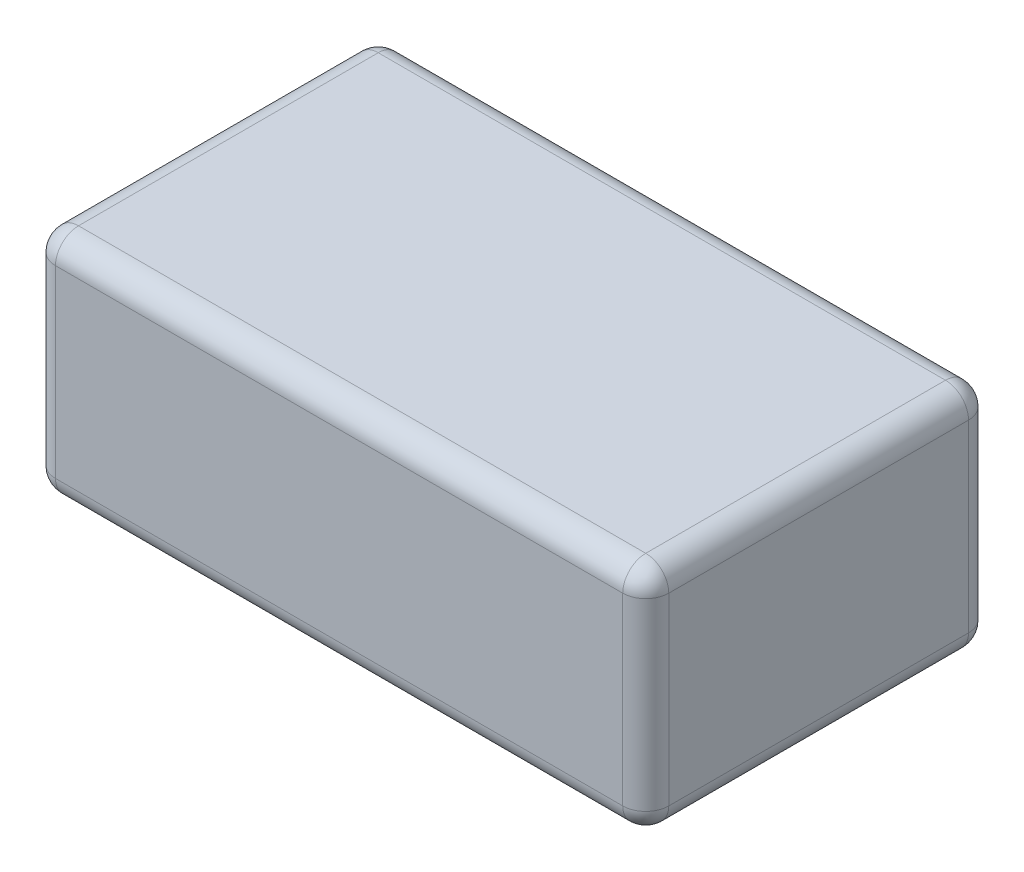
ISO-10303-21;
HEADER;
FILE_DESCRIPTION(('STEP AP214'),'2;1');
FILE_NAME('part.step','',(''),(''),'','','');
FILE_SCHEMA(('AUTOMOTIVE_DESIGN { 1 0 10303 214 1 1 1 1 }'));
ENDSEC;
DATA;
#1=APPLICATION_CONTEXT('core data for automotive mechanical design processes');
#2=APPLICATION_PROTOCOL_DEFINITION('international standard','automotive_design',2000,#1);
#3=PRODUCT_CONTEXT('',#1,'mechanical');
#4=PRODUCT('Part','Part','',(#3));
#5=PRODUCT_RELATED_PRODUCT_CATEGORY('part','',(#4));
#6=PRODUCT_DEFINITION_FORMATION('','',#4);
#7=PRODUCT_DEFINITION_CONTEXT('part definition',#1,'design');
#8=PRODUCT_DEFINITION('design','',#6,#7);
#9=PRODUCT_DEFINITION_SHAPE('','',#8);
#10=(LENGTH_UNIT() NAMED_UNIT(*) SI_UNIT(.MILLI.,.METRE.));
#11=(NAMED_UNIT(*) PLANE_ANGLE_UNIT() SI_UNIT($,.RADIAN.));
#12=(NAMED_UNIT(*) SI_UNIT($,.STERADIAN.) SOLID_ANGLE_UNIT());
#13=UNCERTAINTY_MEASURE_WITH_UNIT(LENGTH_MEASURE(1.E-05),#10,'distance_accuracy_value','');
#14=(GEOMETRIC_REPRESENTATION_CONTEXT(3) GLOBAL_UNCERTAINTY_ASSIGNED_CONTEXT((#13)) GLOBAL_UNIT_ASSIGNED_CONTEXT((#10,
#11,#12)) REPRESENTATION_CONTEXT('',''));
#15=CARTESIAN_POINT('',(0.,0.,0.));
#16=DIRECTION('',(0.,0.,1.));
#17=DIRECTION('',(1.,0.,0.));
#18=AXIS2_PLACEMENT_3D('',#15,#16,#17);
#19=CARTESIAN_POINT('',(-0.845465216249173,0.127,0.826383161041259));
#20=DIRECTION('',(1.,0.,0.));
#21=DIRECTION('',(0.,-0.707106781186548,0.707106781186547));
#22=AXIS2_PLACEMENT_3D('',#19,#20,#21);
#23=CYLINDRICAL_SURFACE('',#22,0.127);
#24=CARTESIAN_POINT('',(-1.56393043249835,0.127,0.826383161041259));
#25=DIRECTION('',(1.,0.,0.));
#26=DIRECTION('',(0.,0.,1.));
#27=AXIS2_PLACEMENT_3D('',#24,#25,#26);
#28=CIRCLE('',#27,0.127);
#29=CARTESIAN_POINT('',(-1.56393043249835,0.127,0.953383161041259));
#30=VERTEX_POINT('',#29);
#31=CARTESIAN_POINT('',(-1.56393043249835,0.,0.826383161041259));
#32=VERTEX_POINT('',#31);
#33=EDGE_CURVE('E178',#30,#32,#28,.T.);
#34=ORIENTED_EDGE('',*,*,#33,.T.);
#35=DIRECTION('',(1.,0.,0.));
#36=VECTOR('',#35,1.);
#37=CARTESIAN_POINT('',(-0.845465216249173,0.,0.826383161041259));
#38=LINE('',#37,#36);
#39=CARTESIAN_POINT('',(1.56393043249835,0.,0.826383161041259));
#40=VERTEX_POINT('',#39);
#41=EDGE_CURVE('E172',#32,#40,#38,.T.);
#42=ORIENTED_EDGE('',*,*,#41,.T.);
#43=CARTESIAN_POINT('',(1.56393043249835,0.127,0.826383161041259));
#44=DIRECTION('',(-1.,0.,0.));
#45=DIRECTION('',(0.,-1.,0.));
#46=AXIS2_PLACEMENT_3D('',#43,#44,#45);
#47=CIRCLE('',#46,0.127);
#48=CARTESIAN_POINT('',(1.56393043249835,0.127,0.953383161041259));
#49=VERTEX_POINT('',#48);
#50=EDGE_CURVE('E11',#40,#49,#47,.T.);
#51=ORIENTED_EDGE('',*,*,#50,.T.);
#52=DIRECTION('',(-1.,0.,0.));
#53=VECTOR('',#52,1.);
#54=CARTESIAN_POINT('',(-0.845465216249173,0.127,0.953383161041259));
#55=LINE('',#54,#53);
#56=EDGE_CURVE('E295',#49,#30,#55,.T.);
#57=ORIENTED_EDGE('',*,*,#56,.T.);
#58=EDGE_LOOP('',(#34,#42,#51,#57));
#59=FACE_BOUND('',#58,.T.);
#60=ADVANCED_FACE('F16',(#59),#23,.T.);
#61=CARTESIAN_POINT('',(1.56393043249835,0.127,0.476691580520629));
#62=DIRECTION('',(0.,0.,-1.));
#63=DIRECTION('',(0.707106781186547,-0.707106781186548,0.));
#64=AXIS2_PLACEMENT_3D('',#61,#62,#63);
#65=CYLINDRICAL_SURFACE('',#64,0.127);
#66=CARTESIAN_POINT('',(1.56393043249835,0.127,0.826383161041259));
#67=DIRECTION('',(0.,0.,-1.));
#68=DIRECTION('',(1.,0.,0.));
#69=AXIS2_PLACEMENT_3D('',#66,#67,#68);
#70=CIRCLE('',#69,0.127);
#71=CARTESIAN_POINT('',(1.69093043249835,0.127,0.826383161041259));
#72=VERTEX_POINT('',#71);
#73=EDGE_CURVE('E27',#72,#40,#70,.T.);
#74=ORIENTED_EDGE('',*,*,#73,.T.);
#75=DIRECTION('',(0.,0.,-1.));
#76=VECTOR('',#75,1.);
#77=CARTESIAN_POINT('',(1.56393043249835,0.,0.476691580520629));
#78=LINE('',#77,#76);
#79=CARTESIAN_POINT('',(1.56393043249835,0.,-0.826383161041259));
#80=VERTEX_POINT('',#79);
#81=EDGE_CURVE('E161',#40,#80,#78,.T.);
#82=ORIENTED_EDGE('',*,*,#81,.T.);
#83=CARTESIAN_POINT('',(1.56393043249835,0.127,-0.826383161041259));
#84=DIRECTION('',(0.,0.,1.));
#85=DIRECTION('',(0.,-1.,0.));
#86=AXIS2_PLACEMENT_3D('',#83,#84,#85);
#87=CIRCLE('',#86,0.127);
#88=CARTESIAN_POINT('',(1.69093043249835,0.127,-0.826383161041259));
#89=VERTEX_POINT('',#88);
#90=EDGE_CURVE('E20',#80,#89,#87,.T.);
#91=ORIENTED_EDGE('',*,*,#90,.T.);
#92=DIRECTION('',(0.,0.,1.));
#93=VECTOR('',#92,1.);
#94=CARTESIAN_POINT('',(1.69093043249835,0.127,0.476691580520629));
#95=LINE('',#94,#93);
#96=EDGE_CURVE('E164',#89,#72,#95,.T.);
#97=ORIENTED_EDGE('',*,*,#96,.T.);
#98=EDGE_LOOP('',(#74,#82,#91,#97));
#99=FACE_BOUND('',#98,.T.);
#100=ADVANCED_FACE('F160',(#99),#65,.T.);
#101=CARTESIAN_POINT('',(1.56393043249835,0.127,0.826383161041259));
#102=DIRECTION('',(-0.408248290463863,-0.816496580927726,-0.408248290463863));
#103=DIRECTION('',(0.577350269189626,-0.577350269189625,0.577350269189626));
#104=AXIS2_PLACEMENT_3D('',#101,#102,#103);
#105=SPHERICAL_SURFACE('',#104,0.127);
#106=ORIENTED_EDGE('',*,*,#73,.F.);
#107=CARTESIAN_POINT('',(1.56393043249835,0.127,0.826383161041259));
#108=DIRECTION('',(0.,-1.,0.));
#109=DIRECTION('',(0.707106781186548,0.,0.707106781186548));
#110=AXIS2_PLACEMENT_3D('',#107,#108,#109);
#111=CIRCLE('',#110,0.127);
#112=EDGE_CURVE('E156',#72,#49,#111,.T.);
#113=ORIENTED_EDGE('',*,*,#112,.T.);
#114=ORIENTED_EDGE('',*,*,#50,.F.);
#115=EDGE_LOOP('',(#106,#113,#114));
#116=FACE_BOUND('',#115,.T.);
#117=ADVANCED_FACE('F154',(#116),#105,.T.);
#118=CARTESIAN_POINT('',(0.845465216249173,0.127,-0.826383161041259));
#119=DIRECTION('',(-1.,0.,0.));
#120=DIRECTION('',(0.,-0.707106781186548,-0.707106781186547));
#121=AXIS2_PLACEMENT_3D('',#118,#119,#120);
#122=CYLINDRICAL_SURFACE('',#121,0.127);
#123=CARTESIAN_POINT('',(1.56393043249835,0.127,-0.826383161041259));
#124=DIRECTION('',(-1.,0.,0.));
#125=DIRECTION('',(0.,0.,-1.));
#126=AXIS2_PLACEMENT_3D('',#123,#124,#125);
#127=CIRCLE('',#126,0.127);
#128=CARTESIAN_POINT('',(1.56393043249835,0.127,-0.953383161041259));
#129=VERTEX_POINT('',#128);
#130=EDGE_CURVE('E41',#129,#80,#127,.T.);
#131=ORIENTED_EDGE('',*,*,#130,.T.);
#132=DIRECTION('',(-1.,0.,0.));
#133=VECTOR('',#132,1.);
#134=CARTESIAN_POINT('',(0.845465216249173,0.,-0.826383161041259));
#135=LINE('',#134,#133);
#136=CARTESIAN_POINT('',(-1.56393043249835,0.,-0.826383161041259));
#137=VERTEX_POINT('',#136);
#138=EDGE_CURVE('E174',#80,#137,#135,.T.);
#139=ORIENTED_EDGE('',*,*,#138,.T.);
#140=CARTESIAN_POINT('',(-1.56393043249835,0.127,-0.826383161041259));
#141=DIRECTION('',(1.,0.,0.));
#142=DIRECTION('',(0.,-1.,0.));
#143=AXIS2_PLACEMENT_3D('',#140,#141,#142);
#144=CIRCLE('',#143,0.127);
#145=CARTESIAN_POINT('',(-1.56393043249835,0.127,-0.953383161041259));
#146=VERTEX_POINT('',#145);
#147=EDGE_CURVE('E226',#137,#146,#144,.T.);
#148=ORIENTED_EDGE('',*,*,#147,.T.);
#149=DIRECTION('',(1.,0.,0.));
#150=VECTOR('',#149,1.);
#151=CARTESIAN_POINT('',(0.845465216249173,0.127,-0.953383161041259));
#152=LINE('',#151,#150);
#153=EDGE_CURVE('E250',#146,#129,#152,.T.);
#154=ORIENTED_EDGE('',*,*,#153,.T.);
#155=EDGE_LOOP('',(#131,#139,#148,#154));
#156=FACE_BOUND('',#155,.T.);
#157=ADVANCED_FACE('F433',(#156),#122,.T.);
#158=CARTESIAN_POINT('',(1.56393043249835,0.127,-0.826383161041259));
#159=DIRECTION('',(-0.408248290463863,-0.816496580927726,0.408248290463863));
#160=DIRECTION('',(0.577350269189626,-0.577350269189625,-0.577350269189626));
#161=AXIS2_PLACEMENT_3D('',#158,#159,#160);
#162=SPHERICAL_SURFACE('',#161,0.127);
#163=ORIENTED_EDGE('',*,*,#130,.F.);
#164=CARTESIAN_POINT('',(1.56393043249835,0.127,-0.826383161041259));
#165=DIRECTION('',(0.,-1.,0.));
#166=DIRECTION('',(0.707106781186548,0.,-0.707106781186548));
#167=AXIS2_PLACEMENT_3D('',#164,#165,#166);
#168=CIRCLE('',#167,0.127);
#169=EDGE_CURVE('E225',#129,#89,#168,.T.);
#170=ORIENTED_EDGE('',*,*,#169,.T.);
#171=ORIENTED_EDGE('',*,*,#90,.F.);
#172=EDGE_LOOP('',(#163,#170,#171));
#173=FACE_BOUND('',#172,.T.);
#174=ADVANCED_FACE('F493',(#173),#162,.T.);
#175=CARTESIAN_POINT('',(-1.56393043249835,0.127,-0.476691580520629));
#176=DIRECTION('',(0.,0.,1.));
#177=DIRECTION('',(-0.707106781186547,-0.707106781186548,0.));
#178=AXIS2_PLACEMENT_3D('',#175,#176,#177);
#179=CYLINDRICAL_SURFACE('',#178,0.127);
#180=CARTESIAN_POINT('',(-1.56393043249835,0.127,-0.826383161041259));
#181=DIRECTION('',(0.,0.,1.));
#182=DIRECTION('',(-1.,0.,0.));
#183=AXIS2_PLACEMENT_3D('',#180,#181,#182);
#184=CIRCLE('',#183,0.127);
#185=CARTESIAN_POINT('',(-1.69093043249835,0.127,-0.826383161041259));
#186=VERTEX_POINT('',#185);
#187=EDGE_CURVE('E229',#186,#137,#184,.T.);
#188=ORIENTED_EDGE('',*,*,#187,.T.);
#189=DIRECTION('',(0.,0.,1.));
#190=VECTOR('',#189,1.);
#191=CARTESIAN_POINT('',(-1.56393043249835,0.,-0.476691580520629));
#192=LINE('',#191,#190);
#193=EDGE_CURVE('E181',#137,#32,#192,.T.);
#194=ORIENTED_EDGE('',*,*,#193,.T.);
#195=CARTESIAN_POINT('',(-1.56393043249835,0.127,0.826383161041259));
#196=DIRECTION('',(0.,0.,-1.));
#197=DIRECTION('',(0.,-1.,0.));
#198=AXIS2_PLACEMENT_3D('',#195,#196,#197);
#199=CIRCLE('',#198,0.127);
#200=CARTESIAN_POINT('',(-1.69093043249835,0.127,0.826383161041259));
#201=VERTEX_POINT('',#200);
#202=EDGE_CURVE('E151',#32,#201,#199,.T.);
#203=ORIENTED_EDGE('',*,*,#202,.T.);
#204=DIRECTION('',(0.,0.,-1.));
#205=VECTOR('',#204,1.);
#206=CARTESIAN_POINT('',(-1.69093043249835,0.127,-0.476691580520629));
#207=LINE('',#206,#205);
#208=EDGE_CURVE('E176',#201,#186,#207,.T.);
#209=ORIENTED_EDGE('',*,*,#208,.T.);
#210=EDGE_LOOP('',(#188,#194,#203,#209));
#211=FACE_BOUND('',#210,.T.);
#212=ADVANCED_FACE('F531',(#211),#179,.T.);
#213=CARTESIAN_POINT('',(-1.56393043249835,0.127,-0.826383161041259));
#214=DIRECTION('',(0.408248290463863,-0.816496580927726,0.408248290463863));
#215=DIRECTION('',(-0.577350269189626,-0.577350269189625,-0.577350269189626));
#216=AXIS2_PLACEMENT_3D('',#213,#214,#215);
#217=SPHERICAL_SURFACE('',#216,0.127);
#218=ORIENTED_EDGE('',*,*,#187,.F.);
#219=CARTESIAN_POINT('',(-1.56393043249835,0.127,-0.826383161041259));
#220=DIRECTION('',(0.,-1.,0.));
#221=DIRECTION('',(-0.707106781186548,0.,-0.707106781186548));
#222=AXIS2_PLACEMENT_3D('',#219,#220,#221);
#223=CIRCLE('',#222,0.127);
#224=EDGE_CURVE('E242',#186,#146,#223,.T.);
#225=ORIENTED_EDGE('',*,*,#224,.T.);
#226=ORIENTED_EDGE('',*,*,#147,.F.);
#227=EDGE_LOOP('',(#218,#225,#226));
#228=FACE_BOUND('',#227,.T.);
#229=ADVANCED_FACE('F444',(#228),#217,.T.);
#230=CARTESIAN_POINT('',(-1.56393043249835,0.127,0.826383161041259));
#231=DIRECTION('',(0.408248290463863,-0.816496580927726,-0.408248290463863));
#232=DIRECTION('',(-0.577350269189626,-0.577350269189625,0.577350269189626));
#233=AXIS2_PLACEMENT_3D('',#230,#231,#232);
#234=SPHERICAL_SURFACE('',#233,0.127);
#235=ORIENTED_EDGE('',*,*,#33,.F.);
#236=CARTESIAN_POINT('',(-1.56393043249835,0.127,0.826383161041259));
#237=DIRECTION('',(0.,-1.,0.));
#238=DIRECTION('',(-0.707106781186548,0.,0.707106781186548));
#239=AXIS2_PLACEMENT_3D('',#236,#237,#238);
#240=CIRCLE('',#239,0.127);
#241=EDGE_CURVE('E216',#30,#201,#240,.T.);
#242=ORIENTED_EDGE('',*,*,#241,.T.);
#243=ORIENTED_EDGE('',*,*,#202,.F.);
#244=EDGE_LOOP('',(#235,#242,#243));
#245=FACE_BOUND('',#244,.T.);
#246=ADVANCED_FACE('F439',(#245),#234,.T.);
#247=CARTESIAN_POINT('',(1.56393043249835,0.,-0.826383161041259));
#248=DIRECTION('',(0.,1.,0.));
#249=DIRECTION('',(0.707106781186548,0.,-0.707106781186548));
#250=AXIS2_PLACEMENT_3D('',#247,#248,#249);
#251=CYLINDRICAL_SURFACE('',#250,0.127);
#252=ORIENTED_EDGE('',*,*,#169,.F.);
#253=DIRECTION('',(0.,1.,0.));
#254=VECTOR('',#253,1.);
#255=CARTESIAN_POINT('',(1.56393043249835,0.,-0.953383161041259));
#256=LINE('',#255,#254);
#257=CARTESIAN_POINT('',(1.56393043249835,1.143,-0.953383161041259));
#258=VERTEX_POINT('',#257);
#259=EDGE_CURVE('E254',#129,#258,#256,.T.);
#260=ORIENTED_EDGE('',*,*,#259,.T.);
#261=CARTESIAN_POINT('',(1.56393043249835,1.143,-0.826383161041259));
#262=DIRECTION('',(0.,-1.,0.));
#263=DIRECTION('',(0.,0.,-1.));
#264=AXIS2_PLACEMENT_3D('',#261,#262,#263);
#265=CIRCLE('',#264,0.127);
#266=CARTESIAN_POINT('',(1.69093043249835,1.143,-0.826383161041259));
#267=VERTEX_POINT('',#266);
#268=EDGE_CURVE('E234',#258,#267,#265,.T.);
#269=ORIENTED_EDGE('',*,*,#268,.T.);
#270=DIRECTION('',(0.,-1.,0.));
#271=VECTOR('',#270,1.);
#272=CARTESIAN_POINT('',(1.69093043249835,0.,-0.826383161041259));
#273=LINE('',#272,#271);
#274=EDGE_CURVE('E235',#267,#89,#273,.T.);
#275=ORIENTED_EDGE('',*,*,#274,.T.);
#276=EDGE_LOOP('',(#252,#260,#269,#275));
#277=FACE_BOUND('',#276,.T.);
#278=ADVANCED_FACE('F377',(#277),#251,.T.);
#279=CARTESIAN_POINT('',(1.69093043249835,0.,-0.953383161041259));
#280=DIRECTION('',(0.,0.,-1.));
#281=DIRECTION('',(0.,-1.,0.));
#282=AXIS2_PLACEMENT_3D('',#279,#280,#281);
#283=PLANE('',#282);
#284=ORIENTED_EDGE('',*,*,#153,.F.);
#285=DIRECTION('',(0.,-1.,0.));
#286=VECTOR('',#285,1.);
#287=CARTESIAN_POINT('',(-1.56393043249835,0.,-0.953383161041259));
#288=LINE('',#287,#286);
#289=CARTESIAN_POINT('',(-1.56393043249835,1.143,-0.953383161041259));
#290=VERTEX_POINT('',#289);
#291=EDGE_CURVE('E255',#290,#146,#288,.T.);
#292=ORIENTED_EDGE('',*,*,#291,.F.);
#293=DIRECTION('',(-1.,0.,0.));
#294=VECTOR('',#293,1.);
#295=CARTESIAN_POINT('',(0.845465216249173,1.143,-0.953383161041259));
#296=LINE('',#295,#294);
#297=EDGE_CURVE('E203',#258,#290,#296,.T.);
#298=ORIENTED_EDGE('',*,*,#297,.F.);
#299=ORIENTED_EDGE('',*,*,#259,.F.);
#300=EDGE_LOOP('',(#284,#292,#298,#299));
#301=FACE_BOUND('',#300,.T.);
#302=ADVANCED_FACE('F555',(#301),#283,.T.);
#303=CARTESIAN_POINT('',(-1.56393043249835,0.,-0.826383161041259));
#304=DIRECTION('',(0.,1.,0.));
#305=DIRECTION('',(-0.707106781186548,0.,-0.707106781186548));
#306=AXIS2_PLACEMENT_3D('',#303,#304,#305);
#307=CYLINDRICAL_SURFACE('',#306,0.127);
#308=ORIENTED_EDGE('',*,*,#224,.F.);
#309=DIRECTION('',(0.,1.,0.));
#310=VECTOR('',#309,1.);
#311=CARTESIAN_POINT('',(-1.69093043249835,0.,-0.826383161041259));
#312=LINE('',#311,#310);
#313=CARTESIAN_POINT('',(-1.69093043249835,1.143,-0.826383161041259));
#314=VERTEX_POINT('',#313);
#315=EDGE_CURVE('E239',#186,#314,#312,.T.);
#316=ORIENTED_EDGE('',*,*,#315,.T.);
#317=CARTESIAN_POINT('',(-1.56393043249835,1.143,-0.826383161041259));
#318=DIRECTION('',(0.,-1.,0.));
#319=DIRECTION('',(-1.,0.,0.));
#320=AXIS2_PLACEMENT_3D('',#317,#318,#319);
#321=CIRCLE('',#320,0.127);
#322=EDGE_CURVE('E189',#314,#290,#321,.T.);
#323=ORIENTED_EDGE('',*,*,#322,.T.);
#324=ORIENTED_EDGE('',*,*,#291,.T.);
#325=EDGE_LOOP('',(#308,#316,#323,#324));
#326=FACE_BOUND('',#325,.T.);
#327=ADVANCED_FACE('F482',(#326),#307,.T.);
#328=CARTESIAN_POINT('',(-1.69093043249835,0.,-0.953383161041259));
#329=DIRECTION('',(-1.,0.,0.));
#330=DIRECTION('',(0.,0.,1.));
#331=AXIS2_PLACEMENT_3D('',#328,#329,#330);
#332=PLANE('',#331);
#333=ORIENTED_EDGE('',*,*,#208,.F.);
#334=DIRECTION('',(0.,-1.,0.));
#335=VECTOR('',#334,1.);
#336=CARTESIAN_POINT('',(-1.69093043249835,0.,0.826383161041259));
#337=LINE('',#336,#335);
#338=CARTESIAN_POINT('',(-1.69093043249835,1.143,0.826383161041259));
#339=VERTEX_POINT('',#338);
#340=EDGE_CURVE('E211',#339,#201,#337,.T.);
#341=ORIENTED_EDGE('',*,*,#340,.F.);
#342=DIRECTION('',(0.,0.,1.));
#343=VECTOR('',#342,1.);
#344=CARTESIAN_POINT('',(-1.69093043249835,1.143,-0.476691580520629));
#345=LINE('',#344,#343);
#346=EDGE_CURVE('E182',#314,#339,#345,.T.);
#347=ORIENTED_EDGE('',*,*,#346,.F.);
#348=ORIENTED_EDGE('',*,*,#315,.F.);
#349=EDGE_LOOP('',(#333,#341,#347,#348));
#350=FACE_BOUND('',#349,.T.);
#351=ADVANCED_FACE('F477',(#350),#332,.T.);
#352=CARTESIAN_POINT('',(0.,0.,0.));
#353=DIRECTION('',(0.,1.,0.));
#354=DIRECTION('',(1.,0.,0.));
#355=AXIS2_PLACEMENT_3D('',#352,#353,#354);
#356=PLANE('',#355);
#357=ORIENTED_EDGE('',*,*,#41,.F.);
#358=ORIENTED_EDGE('',*,*,#193,.F.);
#359=ORIENTED_EDGE('',*,*,#138,.F.);
#360=ORIENTED_EDGE('',*,*,#81,.F.);
#361=EDGE_LOOP('',(#357,#358,#359,#360));
#362=FACE_BOUND('',#361,.T.);
#363=ADVANCED_FACE('F170',(#362),#356,.F.);
#364=CARTESIAN_POINT('',(-1.56393043249835,1.143,-0.476691580520629));
#365=DIRECTION('',(0.,0.,1.));
#366=DIRECTION('',(-0.707106781186547,0.707106781186548,0.));
#367=AXIS2_PLACEMENT_3D('',#364,#365,#366);
#368=CYLINDRICAL_SURFACE('',#367,0.127);
#369=CARTESIAN_POINT('',(-1.56393043249835,1.143,-0.826383161041259));
#370=DIRECTION('',(0.,0.,1.));
#371=DIRECTION('',(0.,1.,0.));
#372=AXIS2_PLACEMENT_3D('',#369,#370,#371);
#373=CIRCLE('',#372,0.127);
#374=CARTESIAN_POINT('',(-1.56393043249835,1.27,-0.826383161041259));
#375=VERTEX_POINT('',#374);
#376=EDGE_CURVE('E215',#375,#314,#373,.T.);
#377=ORIENTED_EDGE('',*,*,#376,.T.);
#378=ORIENTED_EDGE('',*,*,#346,.T.);
#379=CARTESIAN_POINT('',(-1.56393043249835,1.143,0.826383161041259));
#380=DIRECTION('',(0.,0.,-1.));
#381=DIRECTION('',(-1.,0.,0.));
#382=AXIS2_PLACEMENT_3D('',#379,#380,#381);
#383=CIRCLE('',#382,0.127);
#384=CARTESIAN_POINT('',(-1.56393043249835,1.27,0.826383161041259));
#385=VERTEX_POINT('',#384);
#386=EDGE_CURVE('E118',#339,#385,#383,.T.);
#387=ORIENTED_EDGE('',*,*,#386,.T.);
#388=DIRECTION('',(0.,0.,-1.));
#389=VECTOR('',#388,1.);
#390=CARTESIAN_POINT('',(-1.56393043249835,1.27,-0.476691580520629));
#391=LINE('',#390,#389);
#392=EDGE_CURVE('E256',#385,#375,#391,.T.);
#393=ORIENTED_EDGE('',*,*,#392,.T.);
#394=EDGE_LOOP('',(#377,#378,#387,#393));
#395=FACE_BOUND('',#394,.T.);
#396=ADVANCED_FACE('F387',(#395),#368,.T.);
#397=CARTESIAN_POINT('',(-1.56393043249835,1.143,-0.826383161041259));
#398=DIRECTION('',(-0.408248290463863,-0.816496580927726,-0.408248290463864));
#399=DIRECTION('',(-0.577350269189624,0.577350269189628,-0.577350269189625));
#400=AXIS2_PLACEMENT_3D('',#397,#398,#399);
#401=SPHERICAL_SURFACE('',#400,0.127);
#402=ORIENTED_EDGE('',*,*,#376,.F.);
#403=CARTESIAN_POINT('',(-1.56393043249835,1.143,-0.826383161041259));
#404=DIRECTION('',(-1.,0.,0.));
#405=DIRECTION('',(0.,0.707106781186548,-0.707106781186547));
#406=AXIS2_PLACEMENT_3D('',#403,#404,#405);
#407=CIRCLE('',#406,0.127);
#408=EDGE_CURVE('E199',#375,#290,#407,.T.);
#409=ORIENTED_EDGE('',*,*,#408,.T.);
#410=ORIENTED_EDGE('',*,*,#322,.F.);
#411=EDGE_LOOP('',(#402,#409,#410));
#412=FACE_BOUND('',#411,.T.);
#413=ADVANCED_FACE('F18',(#412),#401,.T.);
#414=CARTESIAN_POINT('',(-1.56393043249835,0.,0.826383161041259));
#415=DIRECTION('',(0.,1.,0.));
#416=DIRECTION('',(-0.707106781186548,0.,0.707106781186548));
#417=AXIS2_PLACEMENT_3D('',#414,#415,#416);
#418=CYLINDRICAL_SURFACE('',#417,0.127);
#419=ORIENTED_EDGE('',*,*,#241,.F.);
#420=DIRECTION('',(0.,1.,0.));
#421=VECTOR('',#420,1.);
#422=CARTESIAN_POINT('',(-1.56393043249835,0.,0.953383161041259));
#423=LINE('',#422,#421);
#424=CARTESIAN_POINT('',(-1.56393043249835,1.143,0.953383161041259));
#425=VERTEX_POINT('',#424);
#426=EDGE_CURVE('E197',#30,#425,#423,.T.);
#427=ORIENTED_EDGE('',*,*,#426,.T.);
#428=CARTESIAN_POINT('',(-1.56393043249835,1.143,0.826383161041259));
#429=DIRECTION('',(0.,-1.,0.));
#430=DIRECTION('',(0.,0.,1.));
#431=AXIS2_PLACEMENT_3D('',#428,#429,#430);
#432=CIRCLE('',#431,0.127);
#433=EDGE_CURVE('E107',#425,#339,#432,.T.);
#434=ORIENTED_EDGE('',*,*,#433,.T.);
#435=ORIENTED_EDGE('',*,*,#340,.T.);
#436=EDGE_LOOP('',(#419,#427,#434,#435));
#437=FACE_BOUND('',#436,.T.);
#438=ADVANCED_FACE('F333',(#437),#418,.T.);
#439=CARTESIAN_POINT('',(-1.56393043249835,1.143,0.826383161041259));
#440=DIRECTION('',(-0.408248290463863,-0.816496580927726,0.408248290463864));
#441=DIRECTION('',(-0.577350269189624,0.577350269189628,0.577350269189625));
#442=AXIS2_PLACEMENT_3D('',#439,#440,#441);
#443=SPHERICAL_SURFACE('',#442,0.127);
#444=ORIENTED_EDGE('',*,*,#433,.F.);
#445=CARTESIAN_POINT('',(-1.56393043249835,1.143,0.826383161041259));
#446=DIRECTION('',(-1.,0.,0.));
#447=DIRECTION('',(0.,0.707106781186548,0.707106781186547));
#448=AXIS2_PLACEMENT_3D('',#445,#446,#447);
#449=CIRCLE('',#448,0.127);
#450=EDGE_CURVE('E194',#425,#385,#449,.T.);
#451=ORIENTED_EDGE('',*,*,#450,.T.);
#452=ORIENTED_EDGE('',*,*,#386,.F.);
#453=EDGE_LOOP('',(#444,#451,#452));
#454=FACE_BOUND('',#453,.T.);
#455=ADVANCED_FACE('F330',(#454),#443,.T.);
#456=CARTESIAN_POINT('',(0.845465216249173,1.143,-0.826383161041259));
#457=DIRECTION('',(-1.,0.,0.));
#458=DIRECTION('',(0.,0.707106781186548,-0.707106781186547));
#459=AXIS2_PLACEMENT_3D('',#456,#457,#458);
#460=CYLINDRICAL_SURFACE('',#459,0.127);
#461=ORIENTED_EDGE('',*,*,#408,.F.);
#462=DIRECTION('',(1.,0.,0.));
#463=VECTOR('',#462,1.);
#464=CARTESIAN_POINT('',(0.845465216249173,1.27,-0.826383161041259));
#465=LINE('',#464,#463);
#466=CARTESIAN_POINT('',(1.56393043249835,1.27,-0.826383161041259));
#467=VERTEX_POINT('',#466);
#468=EDGE_CURVE('E204',#375,#467,#465,.T.);
#469=ORIENTED_EDGE('',*,*,#468,.T.);
#470=CARTESIAN_POINT('',(1.56393043249835,1.143,-0.826383161041259));
#471=DIRECTION('',(-1.,0.,0.));
#472=DIRECTION('',(0.,1.,0.));
#473=AXIS2_PLACEMENT_3D('',#470,#471,#472);
#474=CIRCLE('',#473,0.127);
#475=EDGE_CURVE('E230',#467,#258,#474,.T.);
#476=ORIENTED_EDGE('',*,*,#475,.T.);
#477=ORIENTED_EDGE('',*,*,#297,.T.);
#478=EDGE_LOOP('',(#461,#469,#476,#477));
#479=FACE_BOUND('',#478,.T.);
#480=ADVANCED_FACE('F265',(#479),#460,.T.);
#481=CARTESIAN_POINT('',(0.,1.27,0.));
#482=DIRECTION('',(0.,1.,0.));
#483=DIRECTION('',(1.,0.,0.));
#484=AXIS2_PLACEMENT_3D('',#481,#482,#483);
#485=PLANE('',#484);
#486=ORIENTED_EDGE('',*,*,#392,.F.);
#487=DIRECTION('',(-1.,0.,0.));
#488=VECTOR('',#487,1.);
#489=CARTESIAN_POINT('',(-0.845465216249173,1.27,0.826383161041259));
#490=LINE('',#489,#488);
#491=CARTESIAN_POINT('',(1.56393043249835,1.27,0.826383161041259));
#492=VERTEX_POINT('',#491);
#493=EDGE_CURVE('E196',#492,#385,#490,.T.);
#494=ORIENTED_EDGE('',*,*,#493,.F.);
#495=DIRECTION('',(0.,0.,1.));
#496=VECTOR('',#495,1.);
#497=CARTESIAN_POINT('',(1.56393043249835,1.27,0.476691580520629));
#498=LINE('',#497,#496);
#499=EDGE_CURVE('E275',#467,#492,#498,.T.);
#500=ORIENTED_EDGE('',*,*,#499,.F.);
#501=ORIENTED_EDGE('',*,*,#468,.F.);
#502=EDGE_LOOP('',(#486,#494,#500,#501));
#503=FACE_BOUND('',#502,.T.);
#504=ADVANCED_FACE('F276',(#503),#485,.T.);
#505=CARTESIAN_POINT('',(-0.845465216249173,1.143,0.826383161041259));
#506=DIRECTION('',(1.,0.,0.));
#507=DIRECTION('',(0.,0.707106781186548,0.707106781186547));
#508=AXIS2_PLACEMENT_3D('',#505,#506,#507);
#509=CYLINDRICAL_SURFACE('',#508,0.127);
#510=ORIENTED_EDGE('',*,*,#450,.F.);
#511=DIRECTION('',(1.,0.,0.));
#512=VECTOR('',#511,1.);
#513=CARTESIAN_POINT('',(-0.845465216249173,1.143,0.953383161041259));
#514=LINE('',#513,#512);
#515=CARTESIAN_POINT('',(1.56393043249835,1.143,0.953383161041259));
#516=VERTEX_POINT('',#515);
#517=EDGE_CURVE('E297',#425,#516,#514,.T.);
#518=ORIENTED_EDGE('',*,*,#517,.T.);
#519=CARTESIAN_POINT('',(1.56393043249835,1.143,0.826383161041259));
#520=DIRECTION('',(-1.,0.,0.));
#521=DIRECTION('',(0.,0.,1.));
#522=AXIS2_PLACEMENT_3D('',#519,#520,#521);
#523=CIRCLE('',#522,0.127);
#524=EDGE_CURVE('E221',#516,#492,#523,.T.);
#525=ORIENTED_EDGE('',*,*,#524,.T.);
#526=ORIENTED_EDGE('',*,*,#493,.T.);
#527=EDGE_LOOP('',(#510,#518,#525,#526));
#528=FACE_BOUND('',#527,.T.);
#529=ADVANCED_FACE('F327',(#528),#509,.T.);
#530=CARTESIAN_POINT('',(-1.69093043249835,0.,0.953383161041259));
#531=DIRECTION('',(0.,0.,1.));
#532=DIRECTION('',(1.,0.,0.));
#533=AXIS2_PLACEMENT_3D('',#530,#531,#532);
#534=PLANE('',#533);
#535=ORIENTED_EDGE('',*,*,#56,.F.);
#536=DIRECTION('',(0.,-1.,0.));
#537=VECTOR('',#536,1.);
#538=CARTESIAN_POINT('',(1.56393043249835,0.,0.953383161041259));
#539=LINE('',#538,#537);
#540=EDGE_CURVE('E205',#516,#49,#539,.T.);
#541=ORIENTED_EDGE('',*,*,#540,.F.);
#542=ORIENTED_EDGE('',*,*,#517,.F.);
#543=ORIENTED_EDGE('',*,*,#426,.F.);
#544=EDGE_LOOP('',(#535,#541,#542,#543));
#545=FACE_BOUND('',#544,.T.);
#546=ADVANCED_FACE('F344',(#545),#534,.T.);
#547=CARTESIAN_POINT('',(1.56393043249835,1.143,-0.826383161041259));
#548=DIRECTION('',(0.408248290463863,-0.816496580927726,-0.408248290463864));
#549=DIRECTION('',(0.577350269189624,0.577350269189628,-0.577350269189625));
#550=AXIS2_PLACEMENT_3D('',#547,#548,#549);
#551=SPHERICAL_SURFACE('',#550,0.127);
#552=ORIENTED_EDGE('',*,*,#475,.F.);
#553=CARTESIAN_POINT('',(1.56393043249835,1.143,-0.826383161041259));
#554=DIRECTION('',(0.,0.,-1.));
#555=DIRECTION('',(0.707106781186547,0.707106781186548,0.));
#556=AXIS2_PLACEMENT_3D('',#553,#554,#555);
#557=CIRCLE('',#556,0.127);
#558=EDGE_CURVE('E209',#467,#267,#557,.T.);
#559=ORIENTED_EDGE('',*,*,#558,.T.);
#560=ORIENTED_EDGE('',*,*,#268,.F.);
#561=EDGE_LOOP('',(#552,#559,#560));
#562=FACE_BOUND('',#561,.T.);
#563=ADVANCED_FACE('F272',(#562),#551,.T.);
#564=CARTESIAN_POINT('',(1.69093043249835,0.,0.953383161041259));
#565=DIRECTION('',(1.,0.,0.));
#566=DIRECTION('',(0.,1.,0.));
#567=AXIS2_PLACEMENT_3D('',#564,#565,#566);
#568=PLANE('',#567);
#569=ORIENTED_EDGE('',*,*,#96,.F.);
#570=ORIENTED_EDGE('',*,*,#274,.F.);
#571=DIRECTION('',(0.,0.,-1.));
#572=VECTOR('',#571,1.);
#573=CARTESIAN_POINT('',(1.69093043249835,1.143,0.476691580520629));
#574=LINE('',#573,#572);
#575=CARTESIAN_POINT('',(1.69093043249835,1.143,0.826383161041259));
#576=VERTEX_POINT('',#575);
#577=EDGE_CURVE('E282',#576,#267,#574,.T.);
#578=ORIENTED_EDGE('',*,*,#577,.F.);
#579=DIRECTION('',(0.,1.,0.));
#580=VECTOR('',#579,1.);
#581=CARTESIAN_POINT('',(1.69093043249835,0.,0.826383161041259));
#582=LINE('',#581,#580);
#583=EDGE_CURVE('E210',#72,#576,#582,.T.);
#584=ORIENTED_EDGE('',*,*,#583,.F.);
#585=EDGE_LOOP('',(#569,#570,#578,#584));
#586=FACE_BOUND('',#585,.T.);
#587=ADVANCED_FACE('F380',(#586),#568,.T.);
#588=CARTESIAN_POINT('',(1.56393043249835,1.143,0.476691580520629));
#589=DIRECTION('',(0.,0.,-1.));
#590=DIRECTION('',(0.707106781186547,0.707106781186548,0.));
#591=AXIS2_PLACEMENT_3D('',#588,#589,#590);
#592=CYLINDRICAL_SURFACE('',#591,0.127);
#593=ORIENTED_EDGE('',*,*,#558,.F.);
#594=ORIENTED_EDGE('',*,*,#499,.T.);
#595=CARTESIAN_POINT('',(1.56393043249835,1.143,0.826383161041259));
#596=DIRECTION('',(0.,0.,1.));
#597=DIRECTION('',(0.707106781186547,0.707106781186548,0.));
#598=AXIS2_PLACEMENT_3D('',#595,#596,#597);
#599=CIRCLE('',#598,0.127);
#600=EDGE_CURVE('E217',#576,#492,#599,.T.);
#601=ORIENTED_EDGE('',*,*,#600,.F.);
#602=ORIENTED_EDGE('',*,*,#577,.T.);
#603=EDGE_LOOP('',(#593,#594,#601,#602));
#604=FACE_BOUND('',#603,.T.);
#605=ADVANCED_FACE('F285',(#604),#592,.T.);
#606=CARTESIAN_POINT('',(1.56393043249835,0.,0.826383161041259));
#607=DIRECTION('',(0.,1.,0.));
#608=DIRECTION('',(0.707106781186548,0.,0.707106781186548));
#609=AXIS2_PLACEMENT_3D('',#606,#607,#608);
#610=CYLINDRICAL_SURFACE('',#609,0.127);
#611=ORIENTED_EDGE('',*,*,#112,.F.);
#612=ORIENTED_EDGE('',*,*,#583,.T.);
#613=CARTESIAN_POINT('',(1.56393043249835,1.143,0.826383161041259));
#614=DIRECTION('',(0.,-1.,0.));
#615=DIRECTION('',(1.,0.,0.));
#616=AXIS2_PLACEMENT_3D('',#613,#614,#615);
#617=CIRCLE('',#616,0.127);
#618=EDGE_CURVE('E222',#576,#516,#617,.T.);
#619=ORIENTED_EDGE('',*,*,#618,.T.);
#620=ORIENTED_EDGE('',*,*,#540,.T.);
#621=EDGE_LOOP('',(#611,#612,#619,#620));
#622=FACE_BOUND('',#621,.T.);
#623=ADVANCED_FACE('F350',(#622),#610,.T.);
#624=CARTESIAN_POINT('',(1.56393043249835,1.143,0.826383161041259));
#625=DIRECTION('',(0.408248290463863,-0.816496580927726,0.408248290463864));
#626=DIRECTION('',(0.577350269189624,0.577350269189628,0.577350269189625));
#627=AXIS2_PLACEMENT_3D('',#624,#625,#626);
#628=SPHERICAL_SURFACE('',#627,0.127);
#629=ORIENTED_EDGE('',*,*,#618,.F.);
#630=ORIENTED_EDGE('',*,*,#600,.T.);
#631=ORIENTED_EDGE('',*,*,#524,.F.);
#632=EDGE_LOOP('',(#629,#630,#631));
#633=FACE_BOUND('',#632,.T.);
#634=ADVANCED_FACE('F349',(#633),#628,.T.);
#635=CLOSED_SHELL('',(#60,#100,#117,#157,#174,#212,#229,#246,#278,#302,#327,#351,#363,#396,#413,
#438,#455,#480,#504,#529,#546,#563,#587,#605,#623,#634));
#636=MANIFOLD_SOLID_BREP('B1',#635);
#637=ADVANCED_BREP_SHAPE_REPRESENTATION('',(#18,#636),#14);
#638=SHAPE_DEFINITION_REPRESENTATION(#9,#637);
ENDSEC;
END-ISO-10303-21;
